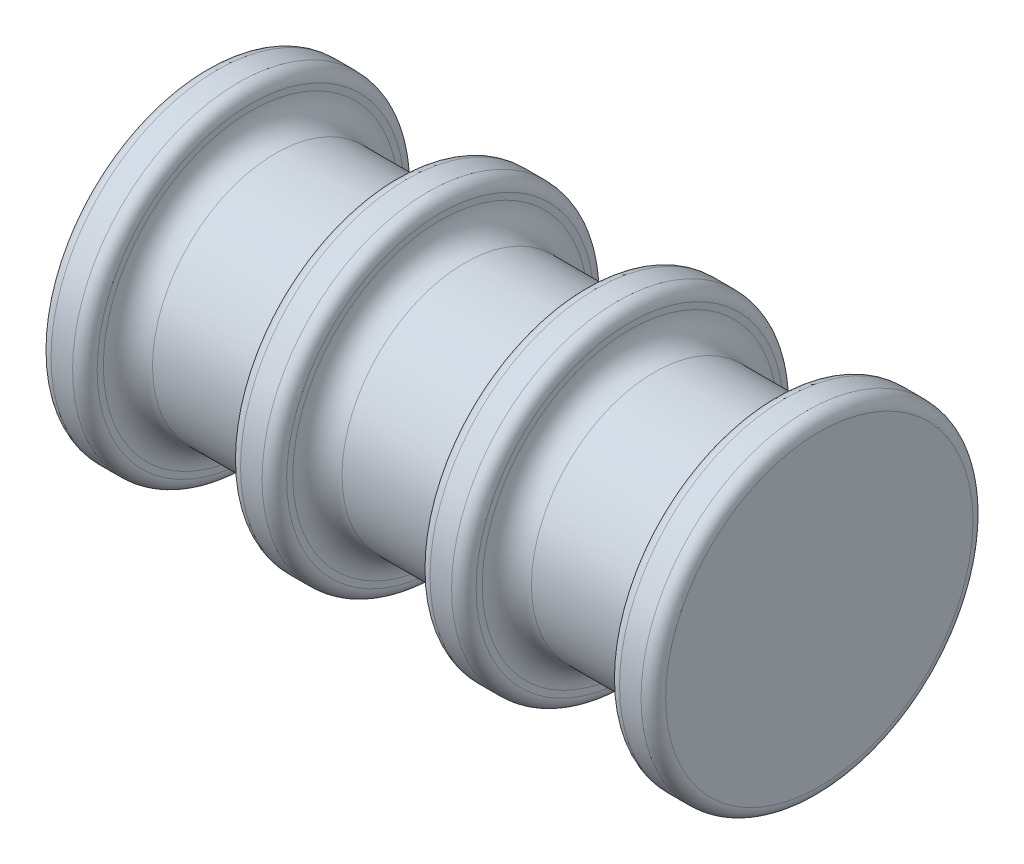
ISO-10303-21;
HEADER;
FILE_DESCRIPTION(('STEP AP214'),'2;1');
FILE_NAME('part.step','',(''),(''),'','','');
FILE_SCHEMA(('AUTOMOTIVE_DESIGN { 1 0 10303 214 1 1 1 1 }'));
ENDSEC;
DATA;
#1=APPLICATION_CONTEXT('core data for automotive mechanical design processes');
#2=APPLICATION_PROTOCOL_DEFINITION('international standard','automotive_design',2000,#1);
#3=PRODUCT_CONTEXT('',#1,'mechanical');
#4=PRODUCT('Part','Part','',(#3));
#5=PRODUCT_RELATED_PRODUCT_CATEGORY('part','',(#4));
#6=PRODUCT_DEFINITION_FORMATION('','',#4);
#7=PRODUCT_DEFINITION_CONTEXT('part definition',#1,'design');
#8=PRODUCT_DEFINITION('design','',#6,#7);
#9=PRODUCT_DEFINITION_SHAPE('','',#8);
#10=(LENGTH_UNIT() NAMED_UNIT(*) SI_UNIT(.MILLI.,.METRE.));
#11=(NAMED_UNIT(*) PLANE_ANGLE_UNIT() SI_UNIT($,.RADIAN.));
#12=(NAMED_UNIT(*) SI_UNIT($,.STERADIAN.) SOLID_ANGLE_UNIT());
#13=UNCERTAINTY_MEASURE_WITH_UNIT(LENGTH_MEASURE(1.E-05),#10,'distance_accuracy_value','');
#14=(GEOMETRIC_REPRESENTATION_CONTEXT(3) GLOBAL_UNCERTAINTY_ASSIGNED_CONTEXT((#13)) GLOBAL_UNIT_ASSIGNED_CONTEXT((#10,
#11,#12)) REPRESENTATION_CONTEXT('',''));
#15=CARTESIAN_POINT('',(0.,0.,0.));
#16=DIRECTION('',(0.,0.,1.));
#17=DIRECTION('',(1.,0.,0.));
#18=AXIS2_PLACEMENT_3D('',#15,#16,#17);
#19=CARTESIAN_POINT('',(0.,0.,0.));
#20=DIRECTION('',(1.,0.,0.));
#21=DIRECTION('',(0.,0.,-1.));
#22=AXIS2_PLACEMENT_3D('',#19,#20,#21);
#23=PLANE('',#22);
#24=CARTESIAN_POINT('',(0.,0.,0.));
#25=DIRECTION('',(1.,0.,0.));
#26=DIRECTION('',(0.,0.,-1.));
#27=AXIS2_PLACEMENT_3D('',#24,#25,#26);
#28=CIRCLE('',#27,5.1054);
#29=CARTESIAN_POINT('',(0.,0.,-5.1054));
#30=VERTEX_POINT('',#29);
#31=EDGE_CURVE('E63',#30,#30,#28,.T.);
#32=ORIENTED_EDGE('',*,*,#31,.T.);
#33=EDGE_LOOP('',(#32));
#34=FACE_BOUND('',#33,.T.);
#35=CARTESIAN_POINT('',(0.,0.,0.));
#36=DIRECTION('',(-1.,0.,0.));
#37=DIRECTION('',(0.,0.,1.));
#38=AXIS2_PLACEMENT_3D('',#35,#36,#37);
#39=CIRCLE('',#38,9.525);
#40=CARTESIAN_POINT('',(0.,0.,9.525));
#41=VERTEX_POINT('',#40);
#42=EDGE_CURVE('E153',#41,#41,#39,.T.);
#43=ORIENTED_EDGE('',*,*,#42,.T.);
#44=EDGE_LOOP('',(#43));
#45=FACE_BOUND('',#44,.T.);
#46=ADVANCED_FACE('F30',(#34,#45),#23,.F.);
#47=CARTESIAN_POINT('',(38.1,0.,-9.525));
#48=DIRECTION('',(-1.,0.,0.));
#49=DIRECTION('',(0.,0.,1.));
#50=AXIS2_PLACEMENT_3D('',#47,#48,#49);
#51=PLANE('',#50);
#52=CARTESIAN_POINT('',(38.1,0.,0.));
#53=DIRECTION('',(-1.,0.,0.));
#54=DIRECTION('',(0.,0.,1.));
#55=AXIS2_PLACEMENT_3D('',#52,#53,#54);
#56=CIRCLE('',#55,9.525);
#57=CARTESIAN_POINT('',(38.1,0.,9.525));
#58=VERTEX_POINT('',#57);
#59=EDGE_CURVE('E72',#58,#58,#56,.T.);
#60=ORIENTED_EDGE('',*,*,#59,.F.);
#61=EDGE_LOOP('',(#60));
#62=FACE_BOUND('',#61,.T.);
#63=ADVANCED_FACE('F178',(#62),#51,.F.);
#64=CARTESIAN_POINT('',(37.338,0.,0.));
#65=DIRECTION('',(-1.,0.,0.));
#66=DIRECTION('',(0.,0.,1.));
#67=AXIS2_PLACEMENT_3D('',#64,#65,#66);
#68=TOROIDAL_SURFACE('',#67,9.525,0.762000000000001);
#69=CARTESIAN_POINT('',(37.338,0.,0.));
#70=DIRECTION('',(-1.,0.,0.));
#71=DIRECTION('',(0.,0.,1.));
#72=AXIS2_PLACEMENT_3D('',#69,#70,#71);
#73=CIRCLE('',#72,10.287);
#74=CARTESIAN_POINT('',(37.338,0.,10.287));
#75=VERTEX_POINT('',#74);
#76=EDGE_CURVE('E75',#75,#75,#73,.T.);
#77=ORIENTED_EDGE('',*,*,#76,.F.);
#78=EDGE_LOOP('',(#77));
#79=FACE_BOUND('',#78,.T.);
#80=ORIENTED_EDGE('',*,*,#59,.T.);
#81=EDGE_LOOP('',(#80));
#82=FACE_BOUND('',#81,.T.);
#83=ADVANCED_FACE('F185',(#79,#82),#68,.T.);
#84=CARTESIAN_POINT('',(0.,0.,0.));
#85=DIRECTION('',(-1.,0.,0.));
#86=DIRECTION('',(0.,0.,1.));
#87=AXIS2_PLACEMENT_3D('',#84,#85,#86);
#88=CYLINDRICAL_SURFACE('',#87,10.287);
#89=CARTESIAN_POINT('',(36.0045,0.,0.));
#90=DIRECTION('',(-1.,0.,0.));
#91=DIRECTION('',(0.,0.,1.));
#92=AXIS2_PLACEMENT_3D('',#89,#90,#91);
#93=CIRCLE('',#92,10.287);
#94=CARTESIAN_POINT('',(36.0045,0.,10.287));
#95=VERTEX_POINT('',#94);
#96=EDGE_CURVE('E78',#95,#95,#93,.T.);
#97=ORIENTED_EDGE('',*,*,#96,.F.);
#98=EDGE_LOOP('',(#97));
#99=FACE_BOUND('',#98,.T.);
#100=ORIENTED_EDGE('',*,*,#76,.T.);
#101=EDGE_LOOP('',(#100));
#102=FACE_BOUND('',#101,.T.);
#103=ADVANCED_FACE('F341',(#99,#102),#88,.T.);
#104=CARTESIAN_POINT('',(36.0045,0.,0.));
#105=DIRECTION('',(-1.,0.,0.));
#106=DIRECTION('',(0.,0.,1.));
#107=AXIS2_PLACEMENT_3D('',#104,#105,#106);
#108=TOROIDAL_SURFACE('',#107,9.525,0.762000000000007);
#109=CARTESIAN_POINT('',(35.2425,0.,0.));
#110=DIRECTION('',(-1.,0.,0.));
#111=DIRECTION('',(0.,0.,1.));
#112=AXIS2_PLACEMENT_3D('',#109,#110,#111);
#113=CIRCLE('',#112,9.525);
#114=CARTESIAN_POINT('',(35.2425,0.,9.525));
#115=VERTEX_POINT('',#114);
#116=EDGE_CURVE('E81',#115,#115,#113,.T.);
#117=ORIENTED_EDGE('',*,*,#116,.F.);
#118=EDGE_LOOP('',(#117));
#119=FACE_BOUND('',#118,.T.);
#120=ORIENTED_EDGE('',*,*,#96,.T.);
#121=EDGE_LOOP('',(#120));
#122=FACE_BOUND('',#121,.T.);
#123=ADVANCED_FACE('F337',(#119,#122),#108,.T.);
#124=CARTESIAN_POINT('',(35.2425,0.,-9.144));
#125=DIRECTION('',(1.,0.,0.));
#126=DIRECTION('',(0.,0.,-1.));
#127=AXIS2_PLACEMENT_3D('',#124,#125,#126);
#128=PLANE('',#127);
#129=CARTESIAN_POINT('',(35.2425,0.,0.));
#130=DIRECTION('',(-1.,0.,0.));
#131=DIRECTION('',(0.,0.,1.));
#132=AXIS2_PLACEMENT_3D('',#129,#130,#131);
#133=CIRCLE('',#132,9.144);
#134=CARTESIAN_POINT('',(35.2425,0.,9.144));
#135=VERTEX_POINT('',#134);
#136=EDGE_CURVE('E84',#135,#135,#133,.T.);
#137=ORIENTED_EDGE('',*,*,#136,.F.);
#138=EDGE_LOOP('',(#137));
#139=FACE_BOUND('',#138,.T.);
#140=ORIENTED_EDGE('',*,*,#116,.T.);
#141=EDGE_LOOP('',(#140));
#142=FACE_BOUND('',#141,.T.);
#143=ADVANCED_FACE('F333',(#139,#142),#128,.F.);
#144=CARTESIAN_POINT('',(33.7185,0.,0.));
#145=DIRECTION('',(-1.,0.,0.));
#146=DIRECTION('',(0.,0.,1.));
#147=AXIS2_PLACEMENT_3D('',#144,#145,#146);
#148=TOROIDAL_SURFACE('',#147,9.144,1.524);
#149=CARTESIAN_POINT('',(33.7185,0.,0.));
#150=DIRECTION('',(-1.,0.,0.));
#151=DIRECTION('',(0.,0.,1.));
#152=AXIS2_PLACEMENT_3D('',#149,#150,#151);
#153=CIRCLE('',#152,7.62);
#154=CARTESIAN_POINT('',(33.7185,0.,7.62));
#155=VERTEX_POINT('',#154);
#156=EDGE_CURVE('E87',#155,#155,#153,.T.);
#157=ORIENTED_EDGE('',*,*,#156,.F.);
#158=EDGE_LOOP('',(#157));
#159=FACE_BOUND('',#158,.T.);
#160=ORIENTED_EDGE('',*,*,#136,.T.);
#161=EDGE_LOOP('',(#160));
#162=FACE_BOUND('',#161,.T.);
#163=ADVANCED_FACE('F329',(#159,#162),#148,.F.);
#164=CARTESIAN_POINT('',(0.,0.,0.));
#165=DIRECTION('',(-1.,0.,0.));
#166=DIRECTION('',(0.,0.,1.));
#167=AXIS2_PLACEMENT_3D('',#164,#165,#166);
#168=CYLINDRICAL_SURFACE('',#167,7.62);
#169=CARTESIAN_POINT('',(27.8765,0.,0.));
#170=DIRECTION('',(-1.,0.,0.));
#171=DIRECTION('',(0.,0.,1.));
#172=AXIS2_PLACEMENT_3D('',#169,#170,#171);
#173=CIRCLE('',#172,7.61999999999999);
#174=CARTESIAN_POINT('',(27.8765,0.,7.61999999999999));
#175=VERTEX_POINT('',#174);
#176=EDGE_CURVE('E90',#175,#175,#173,.T.);
#177=ORIENTED_EDGE('',*,*,#176,.F.);
#178=EDGE_LOOP('',(#177));
#179=FACE_BOUND('',#178,.T.);
#180=ORIENTED_EDGE('',*,*,#156,.T.);
#181=EDGE_LOOP('',(#180));
#182=FACE_BOUND('',#181,.T.);
#183=ADVANCED_FACE('F325',(#179,#182),#168,.T.);
#184=CARTESIAN_POINT('',(27.8765,0.,0.));
#185=DIRECTION('',(-1.,0.,0.));
#186=DIRECTION('',(0.,0.,1.));
#187=AXIS2_PLACEMENT_3D('',#184,#185,#186);
#188=TOROIDAL_SURFACE('',#187,9.14399999999999,1.524);
#189=CARTESIAN_POINT('',(26.3525,0.,0.));
#190=DIRECTION('',(-1.,0.,0.));
#191=DIRECTION('',(0.,0.,1.));
#192=AXIS2_PLACEMENT_3D('',#189,#190,#191);
#193=CIRCLE('',#192,9.14399999999999);
#194=CARTESIAN_POINT('',(26.3525,0.,9.14399999999999));
#195=VERTEX_POINT('',#194);
#196=EDGE_CURVE('E93',#195,#195,#193,.T.);
#197=ORIENTED_EDGE('',*,*,#196,.F.);
#198=EDGE_LOOP('',(#197));
#199=FACE_BOUND('',#198,.T.);
#200=ORIENTED_EDGE('',*,*,#176,.T.);
#201=EDGE_LOOP('',(#200));
#202=FACE_BOUND('',#201,.T.);
#203=ADVANCED_FACE('F321',(#199,#202),#188,.F.);
#204=CARTESIAN_POINT('',(26.3525,0.,-9.525));
#205=DIRECTION('',(-1.,0.,0.));
#206=DIRECTION('',(0.,0.,1.));
#207=AXIS2_PLACEMENT_3D('',#204,#205,#206);
#208=PLANE('',#207);
#209=CARTESIAN_POINT('',(26.3525,0.,0.));
#210=DIRECTION('',(-1.,0.,0.));
#211=DIRECTION('',(0.,0.,1.));
#212=AXIS2_PLACEMENT_3D('',#209,#210,#211);
#213=CIRCLE('',#212,9.525);
#214=CARTESIAN_POINT('',(26.3525,0.,9.525));
#215=VERTEX_POINT('',#214);
#216=EDGE_CURVE('E96',#215,#215,#213,.T.);
#217=ORIENTED_EDGE('',*,*,#216,.F.);
#218=EDGE_LOOP('',(#217));
#219=FACE_BOUND('',#218,.T.);
#220=ORIENTED_EDGE('',*,*,#196,.T.);
#221=EDGE_LOOP('',(#220));
#222=FACE_BOUND('',#221,.T.);
#223=ADVANCED_FACE('F317',(#219,#222),#208,.F.);
#224=CARTESIAN_POINT('',(25.5905,0.,0.));
#225=DIRECTION('',(-1.,0.,0.));
#226=DIRECTION('',(0.,0.,1.));
#227=AXIS2_PLACEMENT_3D('',#224,#225,#226);
#228=TOROIDAL_SURFACE('',#227,9.525,0.762000000000001);
#229=CARTESIAN_POINT('',(25.5905,0.,0.));
#230=DIRECTION('',(-1.,0.,0.));
#231=DIRECTION('',(0.,0.,1.));
#232=AXIS2_PLACEMENT_3D('',#229,#230,#231);
#233=CIRCLE('',#232,10.287);
#234=CARTESIAN_POINT('',(25.5905,0.,10.287));
#235=VERTEX_POINT('',#234);
#236=EDGE_CURVE('E99',#235,#235,#233,.T.);
#237=ORIENTED_EDGE('',*,*,#236,.F.);
#238=EDGE_LOOP('',(#237));
#239=FACE_BOUND('',#238,.T.);
#240=ORIENTED_EDGE('',*,*,#216,.T.);
#241=EDGE_LOOP('',(#240));
#242=FACE_BOUND('',#241,.T.);
#243=ADVANCED_FACE('F313',(#239,#242),#228,.T.);
#244=CARTESIAN_POINT('',(0.,0.,0.));
#245=DIRECTION('',(-1.,0.,0.));
#246=DIRECTION('',(0.,0.,1.));
#247=AXIS2_PLACEMENT_3D('',#244,#245,#246);
#248=CYLINDRICAL_SURFACE('',#247,10.287);
#249=CARTESIAN_POINT('',(24.257,0.,0.));
#250=DIRECTION('',(-1.,0.,0.));
#251=DIRECTION('',(0.,0.,1.));
#252=AXIS2_PLACEMENT_3D('',#249,#250,#251);
#253=CIRCLE('',#252,10.287);
#254=CARTESIAN_POINT('',(24.257,0.,10.287));
#255=VERTEX_POINT('',#254);
#256=EDGE_CURVE('E102',#255,#255,#253,.T.);
#257=ORIENTED_EDGE('',*,*,#256,.F.);
#258=EDGE_LOOP('',(#257));
#259=FACE_BOUND('',#258,.T.);
#260=ORIENTED_EDGE('',*,*,#236,.T.);
#261=EDGE_LOOP('',(#260));
#262=FACE_BOUND('',#261,.T.);
#263=ADVANCED_FACE('F309',(#259,#262),#248,.T.);
#264=CARTESIAN_POINT('',(24.257,0.,0.));
#265=DIRECTION('',(-1.,0.,0.));
#266=DIRECTION('',(0.,0.,1.));
#267=AXIS2_PLACEMENT_3D('',#264,#265,#266);
#268=TOROIDAL_SURFACE('',#267,9.525,0.762000000000001);
#269=CARTESIAN_POINT('',(23.495,0.,0.));
#270=DIRECTION('',(-1.,0.,0.));
#271=DIRECTION('',(0.,0.,1.));
#272=AXIS2_PLACEMENT_3D('',#269,#270,#271);
#273=CIRCLE('',#272,9.525);
#274=CARTESIAN_POINT('',(23.495,0.,9.525));
#275=VERTEX_POINT('',#274);
#276=EDGE_CURVE('E105',#275,#275,#273,.T.);
#277=ORIENTED_EDGE('',*,*,#276,.F.);
#278=EDGE_LOOP('',(#277));
#279=FACE_BOUND('',#278,.T.);
#280=ORIENTED_EDGE('',*,*,#256,.T.);
#281=EDGE_LOOP('',(#280));
#282=FACE_BOUND('',#281,.T.);
#283=ADVANCED_FACE('F305',(#279,#282),#268,.T.);
#284=CARTESIAN_POINT('',(23.495,0.,-9.144));
#285=DIRECTION('',(1.,0.,0.));
#286=DIRECTION('',(0.,0.,-1.));
#287=AXIS2_PLACEMENT_3D('',#284,#285,#286);
#288=PLANE('',#287);
#289=CARTESIAN_POINT('',(23.495,0.,0.));
#290=DIRECTION('',(-1.,0.,0.));
#291=DIRECTION('',(0.,0.,1.));
#292=AXIS2_PLACEMENT_3D('',#289,#290,#291);
#293=CIRCLE('',#292,9.144);
#294=CARTESIAN_POINT('',(23.495,0.,9.144));
#295=VERTEX_POINT('',#294);
#296=EDGE_CURVE('E108',#295,#295,#293,.T.);
#297=ORIENTED_EDGE('',*,*,#296,.F.);
#298=EDGE_LOOP('',(#297));
#299=FACE_BOUND('',#298,.T.);
#300=ORIENTED_EDGE('',*,*,#276,.T.);
#301=EDGE_LOOP('',(#300));
#302=FACE_BOUND('',#301,.T.);
#303=ADVANCED_FACE('F301',(#299,#302),#288,.F.);
#304=CARTESIAN_POINT('',(21.971,0.,0.));
#305=DIRECTION('',(-1.,0.,0.));
#306=DIRECTION('',(0.,0.,1.));
#307=AXIS2_PLACEMENT_3D('',#304,#305,#306);
#308=TOROIDAL_SURFACE('',#307,9.144,1.524);
#309=CARTESIAN_POINT('',(21.971,0.,0.));
#310=DIRECTION('',(-1.,0.,0.));
#311=DIRECTION('',(0.,0.,1.));
#312=AXIS2_PLACEMENT_3D('',#309,#310,#311);
#313=CIRCLE('',#312,7.62);
#314=CARTESIAN_POINT('',(21.971,0.,7.62));
#315=VERTEX_POINT('',#314);
#316=EDGE_CURVE('E111',#315,#315,#313,.T.);
#317=ORIENTED_EDGE('',*,*,#316,.F.);
#318=EDGE_LOOP('',(#317));
#319=FACE_BOUND('',#318,.T.);
#320=ORIENTED_EDGE('',*,*,#296,.T.);
#321=EDGE_LOOP('',(#320));
#322=FACE_BOUND('',#321,.T.);
#323=ADVANCED_FACE('F297',(#319,#322),#308,.F.);
#324=CARTESIAN_POINT('',(0.,0.,0.));
#325=DIRECTION('',(-1.,0.,0.));
#326=DIRECTION('',(0.,0.,1.));
#327=AXIS2_PLACEMENT_3D('',#324,#325,#326);
#328=CYLINDRICAL_SURFACE('',#327,7.62);
#329=CARTESIAN_POINT('',(16.129,0.,0.));
#330=DIRECTION('',(-1.,0.,0.));
#331=DIRECTION('',(0.,0.,1.));
#332=AXIS2_PLACEMENT_3D('',#329,#330,#331);
#333=CIRCLE('',#332,7.62);
#334=CARTESIAN_POINT('',(16.129,0.,7.62));
#335=VERTEX_POINT('',#334);
#336=EDGE_CURVE('E114',#335,#335,#333,.T.);
#337=ORIENTED_EDGE('',*,*,#336,.F.);
#338=EDGE_LOOP('',(#337));
#339=FACE_BOUND('',#338,.T.);
#340=ORIENTED_EDGE('',*,*,#316,.T.);
#341=EDGE_LOOP('',(#340));
#342=FACE_BOUND('',#341,.T.);
#343=ADVANCED_FACE('F293',(#339,#342),#328,.T.);
#344=CARTESIAN_POINT('',(16.129,0.,0.));
#345=DIRECTION('',(-1.,0.,0.));
#346=DIRECTION('',(0.,0.,1.));
#347=AXIS2_PLACEMENT_3D('',#344,#345,#346);
#348=TOROIDAL_SURFACE('',#347,9.144,1.524);
#349=CARTESIAN_POINT('',(14.605,0.,0.));
#350=DIRECTION('',(-1.,0.,0.));
#351=DIRECTION('',(0.,0.,1.));
#352=AXIS2_PLACEMENT_3D('',#349,#350,#351);
#353=CIRCLE('',#352,9.144);
#354=CARTESIAN_POINT('',(14.605,0.,9.144));
#355=VERTEX_POINT('',#354);
#356=EDGE_CURVE('E117',#355,#355,#353,.T.);
#357=ORIENTED_EDGE('',*,*,#356,.F.);
#358=EDGE_LOOP('',(#357));
#359=FACE_BOUND('',#358,.T.);
#360=ORIENTED_EDGE('',*,*,#336,.T.);
#361=EDGE_LOOP('',(#360));
#362=FACE_BOUND('',#361,.T.);
#363=ADVANCED_FACE('F289',(#359,#362),#348,.F.);
#364=CARTESIAN_POINT('',(14.605,0.,-9.525));
#365=DIRECTION('',(-1.,0.,0.));
#366=DIRECTION('',(0.,0.,1.));
#367=AXIS2_PLACEMENT_3D('',#364,#365,#366);
#368=PLANE('',#367);
#369=CARTESIAN_POINT('',(14.605,0.,0.));
#370=DIRECTION('',(-1.,0.,0.));
#371=DIRECTION('',(0.,0.,1.));
#372=AXIS2_PLACEMENT_3D('',#369,#370,#371);
#373=CIRCLE('',#372,9.525);
#374=CARTESIAN_POINT('',(14.605,0.,9.525));
#375=VERTEX_POINT('',#374);
#376=EDGE_CURVE('E120',#375,#375,#373,.T.);
#377=ORIENTED_EDGE('',*,*,#376,.F.);
#378=EDGE_LOOP('',(#377));
#379=FACE_BOUND('',#378,.T.);
#380=ORIENTED_EDGE('',*,*,#356,.T.);
#381=EDGE_LOOP('',(#380));
#382=FACE_BOUND('',#381,.T.);
#383=ADVANCED_FACE('F285',(#379,#382),#368,.F.);
#384=CARTESIAN_POINT('',(13.843,0.,0.));
#385=DIRECTION('',(-1.,0.,0.));
#386=DIRECTION('',(0.,0.,1.));
#387=AXIS2_PLACEMENT_3D('',#384,#385,#386);
#388=TOROIDAL_SURFACE('',#387,9.525,0.762000000000001);
#389=CARTESIAN_POINT('',(13.843,0.,0.));
#390=DIRECTION('',(-1.,0.,0.));
#391=DIRECTION('',(0.,0.,1.));
#392=AXIS2_PLACEMENT_3D('',#389,#390,#391);
#393=CIRCLE('',#392,10.287);
#394=CARTESIAN_POINT('',(13.843,0.,10.287));
#395=VERTEX_POINT('',#394);
#396=EDGE_CURVE('E123',#395,#395,#393,.T.);
#397=ORIENTED_EDGE('',*,*,#396,.F.);
#398=EDGE_LOOP('',(#397));
#399=FACE_BOUND('',#398,.T.);
#400=ORIENTED_EDGE('',*,*,#376,.T.);
#401=EDGE_LOOP('',(#400));
#402=FACE_BOUND('',#401,.T.);
#403=ADVANCED_FACE('F281',(#399,#402),#388,.T.);
#404=CARTESIAN_POINT('',(0.,0.,0.));
#405=DIRECTION('',(-1.,0.,0.));
#406=DIRECTION('',(0.,0.,1.));
#407=AXIS2_PLACEMENT_3D('',#404,#405,#406);
#408=CYLINDRICAL_SURFACE('',#407,10.287);
#409=CARTESIAN_POINT('',(12.5095,0.,0.));
#410=DIRECTION('',(-1.,0.,0.));
#411=DIRECTION('',(0.,0.,1.));
#412=AXIS2_PLACEMENT_3D('',#409,#410,#411);
#413=CIRCLE('',#412,10.287);
#414=CARTESIAN_POINT('',(12.5095,0.,10.287));
#415=VERTEX_POINT('',#414);
#416=EDGE_CURVE('E126',#415,#415,#413,.T.);
#417=ORIENTED_EDGE('',*,*,#416,.F.);
#418=EDGE_LOOP('',(#417));
#419=FACE_BOUND('',#418,.T.);
#420=ORIENTED_EDGE('',*,*,#396,.T.);
#421=EDGE_LOOP('',(#420));
#422=FACE_BOUND('',#421,.T.);
#423=ADVANCED_FACE('F277',(#419,#422),#408,.T.);
#424=CARTESIAN_POINT('',(12.5095,0.,0.));
#425=DIRECTION('',(-1.,0.,0.));
#426=DIRECTION('',(0.,0.,1.));
#427=AXIS2_PLACEMENT_3D('',#424,#425,#426);
#428=TOROIDAL_SURFACE('',#427,9.525,0.762000000000001);
#429=CARTESIAN_POINT('',(11.7475,0.,0.));
#430=DIRECTION('',(-1.,0.,0.));
#431=DIRECTION('',(0.,0.,1.));
#432=AXIS2_PLACEMENT_3D('',#429,#430,#431);
#433=CIRCLE('',#432,9.525);
#434=CARTESIAN_POINT('',(11.7475,0.,9.525));
#435=VERTEX_POINT('',#434);
#436=EDGE_CURVE('E129',#435,#435,#433,.T.);
#437=ORIENTED_EDGE('',*,*,#436,.F.);
#438=EDGE_LOOP('',(#437));
#439=FACE_BOUND('',#438,.T.);
#440=ORIENTED_EDGE('',*,*,#416,.T.);
#441=EDGE_LOOP('',(#440));
#442=FACE_BOUND('',#441,.T.);
#443=ADVANCED_FACE('F273',(#439,#442),#428,.T.);
#444=CARTESIAN_POINT('',(11.7475,0.,-9.144));
#445=DIRECTION('',(1.,0.,0.));
#446=DIRECTION('',(0.,0.,-1.));
#447=AXIS2_PLACEMENT_3D('',#444,#445,#446);
#448=PLANE('',#447);
#449=CARTESIAN_POINT('',(11.7475,0.,0.));
#450=DIRECTION('',(-1.,0.,0.));
#451=DIRECTION('',(0.,0.,1.));
#452=AXIS2_PLACEMENT_3D('',#449,#450,#451);
#453=CIRCLE('',#452,9.144);
#454=CARTESIAN_POINT('',(11.7475,0.,9.144));
#455=VERTEX_POINT('',#454);
#456=EDGE_CURVE('E132',#455,#455,#453,.T.);
#457=ORIENTED_EDGE('',*,*,#456,.F.);
#458=EDGE_LOOP('',(#457));
#459=FACE_BOUND('',#458,.T.);
#460=ORIENTED_EDGE('',*,*,#436,.T.);
#461=EDGE_LOOP('',(#460));
#462=FACE_BOUND('',#461,.T.);
#463=ADVANCED_FACE('F269',(#459,#462),#448,.F.);
#464=CARTESIAN_POINT('',(10.2235,0.,0.));
#465=DIRECTION('',(-1.,0.,0.));
#466=DIRECTION('',(0.,0.,1.));
#467=AXIS2_PLACEMENT_3D('',#464,#465,#466);
#468=TOROIDAL_SURFACE('',#467,9.144,1.524);
#469=CARTESIAN_POINT('',(10.2235,0.,0.));
#470=DIRECTION('',(-1.,0.,0.));
#471=DIRECTION('',(0.,0.,1.));
#472=AXIS2_PLACEMENT_3D('',#469,#470,#471);
#473=CIRCLE('',#472,7.62);
#474=CARTESIAN_POINT('',(10.2235,0.,7.62));
#475=VERTEX_POINT('',#474);
#476=EDGE_CURVE('E135',#475,#475,#473,.T.);
#477=ORIENTED_EDGE('',*,*,#476,.F.);
#478=EDGE_LOOP('',(#477));
#479=FACE_BOUND('',#478,.T.);
#480=ORIENTED_EDGE('',*,*,#456,.T.);
#481=EDGE_LOOP('',(#480));
#482=FACE_BOUND('',#481,.T.);
#483=ADVANCED_FACE('F265',(#479,#482),#468,.F.);
#484=CARTESIAN_POINT('',(0.,0.,0.));
#485=DIRECTION('',(-1.,0.,0.));
#486=DIRECTION('',(0.,0.,1.));
#487=AXIS2_PLACEMENT_3D('',#484,#485,#486);
#488=CYLINDRICAL_SURFACE('',#487,7.62);
#489=CARTESIAN_POINT('',(4.3815,0.,0.));
#490=DIRECTION('',(-1.,0.,0.));
#491=DIRECTION('',(0.,0.,1.));
#492=AXIS2_PLACEMENT_3D('',#489,#490,#491);
#493=CIRCLE('',#492,7.62);
#494=CARTESIAN_POINT('',(4.3815,0.,7.62));
#495=VERTEX_POINT('',#494);
#496=EDGE_CURVE('E138',#495,#495,#493,.T.);
#497=ORIENTED_EDGE('',*,*,#496,.F.);
#498=EDGE_LOOP('',(#497));
#499=FACE_BOUND('',#498,.T.);
#500=ORIENTED_EDGE('',*,*,#476,.T.);
#501=EDGE_LOOP('',(#500));
#502=FACE_BOUND('',#501,.T.);
#503=ADVANCED_FACE('F261',(#499,#502),#488,.T.);
#504=CARTESIAN_POINT('',(4.3815,0.,0.));
#505=DIRECTION('',(-1.,0.,0.));
#506=DIRECTION('',(0.,0.,1.));
#507=AXIS2_PLACEMENT_3D('',#504,#505,#506);
#508=TOROIDAL_SURFACE('',#507,9.144,1.524);
#509=CARTESIAN_POINT('',(2.8575,0.,0.));
#510=DIRECTION('',(-1.,0.,0.));
#511=DIRECTION('',(0.,0.,1.));
#512=AXIS2_PLACEMENT_3D('',#509,#510,#511);
#513=CIRCLE('',#512,9.144);
#514=CARTESIAN_POINT('',(2.8575,0.,9.144));
#515=VERTEX_POINT('',#514);
#516=EDGE_CURVE('E141',#515,#515,#513,.T.);
#517=ORIENTED_EDGE('',*,*,#516,.F.);
#518=EDGE_LOOP('',(#517));
#519=FACE_BOUND('',#518,.T.);
#520=ORIENTED_EDGE('',*,*,#496,.T.);
#521=EDGE_LOOP('',(#520));
#522=FACE_BOUND('',#521,.T.);
#523=ADVANCED_FACE('F257',(#519,#522),#508,.F.);
#524=CARTESIAN_POINT('',(2.8575,0.,-9.525));
#525=DIRECTION('',(-1.,0.,0.));
#526=DIRECTION('',(0.,0.,1.));
#527=AXIS2_PLACEMENT_3D('',#524,#525,#526);
#528=PLANE('',#527);
#529=CARTESIAN_POINT('',(2.8575,0.,0.));
#530=DIRECTION('',(-1.,0.,0.));
#531=DIRECTION('',(0.,0.,1.));
#532=AXIS2_PLACEMENT_3D('',#529,#530,#531);
#533=CIRCLE('',#532,9.525);
#534=CARTESIAN_POINT('',(2.8575,0.,9.525));
#535=VERTEX_POINT('',#534);
#536=EDGE_CURVE('E144',#535,#535,#533,.T.);
#537=ORIENTED_EDGE('',*,*,#536,.F.);
#538=EDGE_LOOP('',(#537));
#539=FACE_BOUND('',#538,.T.);
#540=ORIENTED_EDGE('',*,*,#516,.T.);
#541=EDGE_LOOP('',(#540));
#542=FACE_BOUND('',#541,.T.);
#543=ADVANCED_FACE('F253',(#539,#542),#528,.F.);
#544=CARTESIAN_POINT('',(2.0955,0.,0.));
#545=DIRECTION('',(-1.,0.,0.));
#546=DIRECTION('',(0.,0.,1.));
#547=AXIS2_PLACEMENT_3D('',#544,#545,#546);
#548=TOROIDAL_SURFACE('',#547,9.525,0.761999999999999);
#549=CARTESIAN_POINT('',(2.0955,0.,0.));
#550=DIRECTION('',(-1.,0.,0.));
#551=DIRECTION('',(0.,0.,1.));
#552=AXIS2_PLACEMENT_3D('',#549,#550,#551);
#553=CIRCLE('',#552,10.287);
#554=CARTESIAN_POINT('',(2.0955,0.,10.287));
#555=VERTEX_POINT('',#554);
#556=EDGE_CURVE('E147',#555,#555,#553,.T.);
#557=ORIENTED_EDGE('',*,*,#556,.F.);
#558=EDGE_LOOP('',(#557));
#559=FACE_BOUND('',#558,.T.);
#560=ORIENTED_EDGE('',*,*,#536,.T.);
#561=EDGE_LOOP('',(#560));
#562=FACE_BOUND('',#561,.T.);
#563=ADVANCED_FACE('F249',(#559,#562),#548,.T.);
#564=CARTESIAN_POINT('',(0.,0.,0.));
#565=DIRECTION('',(-1.,0.,0.));
#566=DIRECTION('',(0.,0.,1.));
#567=AXIS2_PLACEMENT_3D('',#564,#565,#566);
#568=CYLINDRICAL_SURFACE('',#567,10.287);
#569=CARTESIAN_POINT('',(0.762,0.,0.));
#570=DIRECTION('',(-1.,0.,0.));
#571=DIRECTION('',(0.,0.,1.));
#572=AXIS2_PLACEMENT_3D('',#569,#570,#571);
#573=CIRCLE('',#572,10.287);
#574=CARTESIAN_POINT('',(0.762,0.,10.287));
#575=VERTEX_POINT('',#574);
#576=EDGE_CURVE('E150',#575,#575,#573,.T.);
#577=ORIENTED_EDGE('',*,*,#576,.F.);
#578=EDGE_LOOP('',(#577));
#579=FACE_BOUND('',#578,.T.);
#580=ORIENTED_EDGE('',*,*,#556,.T.);
#581=EDGE_LOOP('',(#580));
#582=FACE_BOUND('',#581,.T.);
#583=ADVANCED_FACE('F245',(#579,#582),#568,.T.);
#584=CARTESIAN_POINT('',(0.762,0.,0.));
#585=DIRECTION('',(-1.,0.,0.));
#586=DIRECTION('',(0.,0.,1.));
#587=AXIS2_PLACEMENT_3D('',#584,#585,#586);
#588=TOROIDAL_SURFACE('',#587,9.525,0.761999999999999);
#589=ORIENTED_EDGE('',*,*,#42,.F.);
#590=EDGE_LOOP('',(#589));
#591=FACE_BOUND('',#590,.T.);
#592=ORIENTED_EDGE('',*,*,#576,.T.);
#593=EDGE_LOOP('',(#592));
#594=FACE_BOUND('',#593,.T.);
#595=ADVANCED_FACE('F239',(#591,#594),#588,.T.);
#596=CARTESIAN_POINT('',(0.254,0.,0.));
#597=DIRECTION('',(-1.,0.,0.));
#598=DIRECTION('',(0.,0.,1.));
#599=AXIS2_PLACEMENT_3D('',#596,#597,#598);
#600=CYLINDRICAL_SURFACE('',#599,5.08);
#601=CARTESIAN_POINT('',(0.0254000000000003,0.,0.));
#602=DIRECTION('',(1.,0.,0.));
#603=DIRECTION('',(0.,0.,-1.));
#604=AXIS2_PLACEMENT_3D('',#601,#602,#603);
#605=CIRCLE('',#604,5.08);
#606=CARTESIAN_POINT('',(0.0254000000000003,0.,-5.08));
#607=VERTEX_POINT('',#606);
#608=EDGE_CURVE('E66',#607,#607,#605,.F.);
#609=ORIENTED_EDGE('',*,*,#608,.T.);
#610=EDGE_LOOP('',(#609));
#611=FACE_BOUND('',#610,.T.);
#612=CARTESIAN_POINT('',(0.2286,0.,0.));
#613=DIRECTION('',(-1.,0.,0.));
#614=DIRECTION('',(0.,0.,1.));
#615=AXIS2_PLACEMENT_3D('',#612,#613,#614);
#616=CIRCLE('',#615,5.08);
#617=CARTESIAN_POINT('',(0.2286,0.,5.08));
#618=VERTEX_POINT('',#617);
#619=EDGE_CURVE('E69',#618,#618,#616,.F.);
#620=ORIENTED_EDGE('',*,*,#619,.T.);
#621=EDGE_LOOP('',(#620));
#622=FACE_BOUND('',#621,.T.);
#623=ADVANCED_FACE('F233',(#611,#622),#600,.F.);
#624=CARTESIAN_POINT('',(0.254,0.,0.));
#625=DIRECTION('',(-1.,0.,0.));
#626=DIRECTION('',(0.,0.,1.));
#627=AXIS2_PLACEMENT_3D('',#624,#625,#626);
#628=PLANE('',#627);
#629=CARTESIAN_POINT('',(0.254,0.,0.));
#630=DIRECTION('',(-1.,0.,0.));
#631=DIRECTION('',(0.,0.,1.));
#632=AXIS2_PLACEMENT_3D('',#629,#630,#631);
#633=CIRCLE('',#632,3.937);
#634=CARTESIAN_POINT('',(0.254,0.,3.937));
#635=VERTEX_POINT('',#634);
#636=EDGE_CURVE('E38',#635,#635,#633,.F.);
#637=ORIENTED_EDGE('',*,*,#636,.T.);
#638=EDGE_LOOP('',(#637));
#639=FACE_BOUND('',#638,.T.);
#640=CARTESIAN_POINT('',(0.254,0.,0.));
#641=DIRECTION('',(-1.,0.,0.));
#642=DIRECTION('',(0.,0.,1.));
#643=AXIS2_PLACEMENT_3D('',#640,#641,#642);
#644=CIRCLE('',#643,5.0546);
#645=CARTESIAN_POINT('',(0.254,0.,5.0546));
#646=VERTEX_POINT('',#645);
#647=EDGE_CURVE('E60',#646,#646,#644,.T.);
#648=ORIENTED_EDGE('',*,*,#647,.T.);
#649=EDGE_LOOP('',(#648));
#650=FACE_BOUND('',#649,.T.);
#651=ADVANCED_FACE('F174',(#639,#650),#628,.T.);
#652=CARTESIAN_POINT('',(0.,0.,0.));
#653=DIRECTION('',(1.,0.,0.));
#654=DIRECTION('',(0.,0.,-1.));
#655=AXIS2_PLACEMENT_3D('',#652,#653,#654);
#656=CIRCLE('',#655,3.683);
#657=CARTESIAN_POINT('',(0.,0.,-3.683));
#658=VERTEX_POINT('',#657);
#659=EDGE_CURVE('E10',#658,#658,#656,.F.);
#660=ORIENTED_EDGE('',*,*,#659,.T.);
#661=EDGE_LOOP('',(#660));
#662=FACE_BOUND('',#661,.T.);
#663=CARTESIAN_POINT('',(0.,0.,0.));
#664=DIRECTION('',(1.,0.,0.));
#665=DIRECTION('',(0.,0.,-1.));
#666=AXIS2_PLACEMENT_3D('',#663,#664,#665);
#667=CIRCLE('',#666,1.89058524938029);
#668=CARTESIAN_POINT('',(0.,0.,-1.89058524938029));
#669=VERTEX_POINT('',#668);
#670=EDGE_CURVE('E42',#669,#669,#667,.T.);
#671=ORIENTED_EDGE('',*,*,#670,.T.);
#672=EDGE_LOOP('',(#671));
#673=FACE_BOUND('',#672,.T.);
#674=ADVANCED_FACE('F163',(#662,#673),#23,.F.);
#675=CARTESIAN_POINT('',(0.2032,0.,0.));
#676=DIRECTION('',(-1.,0.,0.));
#677=DIRECTION('',(0.,0.,1.));
#678=AXIS2_PLACEMENT_3D('',#675,#676,#677);
#679=PLANE('',#678);
#680=CARTESIAN_POINT('',(0.2032,0.,0.));
#681=DIRECTION('',(-1.,0.,0.));
#682=DIRECTION('',(0.,0.,1.));
#683=AXIS2_PLACEMENT_3D('',#680,#681,#682);
#684=CIRCLE('',#683,1.68738524938029);
#685=CARTESIAN_POINT('',(0.2032,0.,1.68738524938029));
#686=VERTEX_POINT('',#685);
#687=EDGE_CURVE('E51',#686,#686,#684,.T.);
#688=ORIENTED_EDGE('',*,*,#687,.T.);
#689=EDGE_LOOP('',(#688));
#690=FACE_BOUND('',#689,.T.);
#691=CARTESIAN_POINT('',(0.2032,0.,0.));
#692=DIRECTION('',(-1.,0.,0.));
#693=DIRECTION('',(0.,0.,1.));
#694=AXIS2_PLACEMENT_3D('',#691,#692,#693);
#695=CIRCLE('',#694,1.26587117892996);
#696=CARTESIAN_POINT('',(0.2032,0.,1.26587117892996));
#697=VERTEX_POINT('',#696);
#698=EDGE_CURVE('E48',#697,#697,#695,.T.);
#699=ORIENTED_EDGE('',*,*,#698,.F.);
#700=EDGE_LOOP('',(#699));
#701=FACE_BOUND('',#700,.T.);
#702=ADVANCED_FACE('F161',(#690,#701),#679,.T.);
#703=CARTESIAN_POINT('',(0.2032,0.,0.));
#704=DIRECTION('',(-1.,0.,0.));
#705=DIRECTION('',(0.,0.,1.));
#706=AXIS2_PLACEMENT_3D('',#703,#704,#705);
#707=CYLINDRICAL_SURFACE('',#706,1.26587117892996);
#708=CARTESIAN_POINT('',(0.1016,0.,0.));
#709=DIRECTION('',(1.,0.,0.));
#710=DIRECTION('',(0.,0.,-1.));
#711=AXIS2_PLACEMENT_3D('',#708,#709,#710);
#712=CIRCLE('',#711,1.26587117892996);
#713=CARTESIAN_POINT('',(0.1016,0.,-1.26587117892996));
#714=VERTEX_POINT('',#713);
#715=EDGE_CURVE('E54',#714,#714,#712,.T.);
#716=ORIENTED_EDGE('',*,*,#715,.T.);
#717=EDGE_LOOP('',(#716));
#718=FACE_BOUND('',#717,.T.);
#719=ORIENTED_EDGE('',*,*,#698,.T.);
#720=EDGE_LOOP('',(#719));
#721=FACE_BOUND('',#720,.T.);
#722=ADVANCED_FACE('F159',(#718,#721),#707,.T.);
#723=CARTESIAN_POINT('',(0.,0.,0.));
#724=DIRECTION('',(1.,0.,0.));
#725=DIRECTION('',(0.,0.,-1.));
#726=AXIS2_PLACEMENT_3D('',#723,#724,#725);
#727=CIRCLE('',#726,1.16427117892996);
#728=CARTESIAN_POINT('',(0.,0.,-1.16427117892996));
#729=VERTEX_POINT('',#728);
#730=EDGE_CURVE('E57',#729,#729,#727,.F.);
#731=ORIENTED_EDGE('',*,*,#730,.T.);
#732=EDGE_LOOP('',(#731));
#733=FACE_BOUND('',#732,.T.);
#734=ADVANCED_FACE('F170',(#733),#23,.F.);
#735=CARTESIAN_POINT('',(0.0254000000000003,0.,0.));
#736=DIRECTION('',(1.,0.,0.));
#737=DIRECTION('',(0.,0.,-1.));
#738=AXIS2_PLACEMENT_3D('',#735,#736,#737);
#739=TOROIDAL_SURFACE('',#738,5.1054,0.0254);
#740=ORIENTED_EDGE('',*,*,#31,.F.);
#741=EDGE_LOOP('',(#740));
#742=FACE_BOUND('',#741,.T.);
#743=ORIENTED_EDGE('',*,*,#608,.F.);
#744=EDGE_LOOP('',(#743));
#745=FACE_BOUND('',#744,.T.);
#746=ADVANCED_FACE('F191',(#742,#745),#739,.T.);
#747=CARTESIAN_POINT('',(0.2286,0.,0.));
#748=DIRECTION('',(-1.,0.,0.));
#749=DIRECTION('',(0.,0.,1.));
#750=AXIS2_PLACEMENT_3D('',#747,#748,#749);
#751=TOROIDAL_SURFACE('',#750,5.0546,0.0254);
#752=ORIENTED_EDGE('',*,*,#619,.F.);
#753=EDGE_LOOP('',(#752));
#754=FACE_BOUND('',#753,.T.);
#755=ORIENTED_EDGE('',*,*,#647,.F.);
#756=EDGE_LOOP('',(#755));
#757=FACE_BOUND('',#756,.T.);
#758=ADVANCED_FACE('F198',(#754,#757),#751,.F.);
#759=CARTESIAN_POINT('',(0.1016,0.,0.));
#760=DIRECTION('',(1.,0.,0.));
#761=DIRECTION('',(0.,0.,-1.));
#762=AXIS2_PLACEMENT_3D('',#759,#760,#761);
#763=TOROIDAL_SURFACE('',#762,1.16427117892996,0.1016);
#764=ORIENTED_EDGE('',*,*,#715,.F.);
#765=EDGE_LOOP('',(#764));
#766=FACE_BOUND('',#765,.T.);
#767=ORIENTED_EDGE('',*,*,#730,.F.);
#768=EDGE_LOOP('',(#767));
#769=FACE_BOUND('',#768,.T.);
#770=ADVANCED_FACE('F202',(#766,#769),#763,.T.);
#771=CARTESIAN_POINT('',(0.1016,0.,0.));
#772=DIRECTION('',(1.,0.,0.));
#773=DIRECTION('',(0.,0.,-1.));
#774=AXIS2_PLACEMENT_3D('',#771,#772,#773);
#775=TOROIDAL_SURFACE('',#774,1.89058524938029,0.1016);
#776=ORIENTED_EDGE('',*,*,#670,.F.);
#777=EDGE_LOOP('',(#776));
#778=FACE_BOUND('',#777,.T.);
#779=CARTESIAN_POINT('',(0.1016,0.,0.));
#780=DIRECTION('',(1.,0.,0.));
#781=DIRECTION('',(0.,0.,-1.));
#782=AXIS2_PLACEMENT_3D('',#779,#780,#781);
#783=CIRCLE('',#782,1.78898524938029);
#784=CARTESIAN_POINT('',(0.1016,0.,-1.78898524938029));
#785=VERTEX_POINT('',#784);
#786=EDGE_CURVE('E45',#785,#785,#783,.F.);
#787=ORIENTED_EDGE('',*,*,#786,.F.);
#788=EDGE_LOOP('',(#787));
#789=FACE_BOUND('',#788,.T.);
#790=ADVANCED_FACE('F204',(#778,#789),#775,.T.);
#791=CARTESIAN_POINT('',(0.1016,0.,0.));
#792=DIRECTION('',(-1.,0.,0.));
#793=DIRECTION('',(0.,0.,1.));
#794=AXIS2_PLACEMENT_3D('',#791,#792,#793);
#795=TOROIDAL_SURFACE('',#794,1.68738524938029,0.1016);
#796=ORIENTED_EDGE('',*,*,#786,.T.);
#797=EDGE_LOOP('',(#796));
#798=FACE_BOUND('',#797,.T.);
#799=ORIENTED_EDGE('',*,*,#687,.F.);
#800=EDGE_LOOP('',(#799));
#801=FACE_BOUND('',#800,.T.);
#802=ADVANCED_FACE('F210',(#798,#801),#795,.F.);
#803=CARTESIAN_POINT('',(0.127,0.,0.));
#804=DIRECTION('',(1.,0.,0.));
#805=DIRECTION('',(0.,0.,-1.));
#806=AXIS2_PLACEMENT_3D('',#803,#804,#805);
#807=TOROIDAL_SURFACE('',#806,3.683,0.127);
#808=ORIENTED_EDGE('',*,*,#659,.F.);
#809=EDGE_LOOP('',(#808));
#810=FACE_BOUND('',#809,.T.);
#811=CARTESIAN_POINT('',(0.127,0.,0.));
#812=DIRECTION('',(1.,0.,0.));
#813=DIRECTION('',(0.,0.,-1.));
#814=AXIS2_PLACEMENT_3D('',#811,#812,#813);
#815=CIRCLE('',#814,3.81);
#816=CARTESIAN_POINT('',(0.127,0.,-3.81));
#817=VERTEX_POINT('',#816);
#818=EDGE_CURVE('E34',#817,#817,#815,.T.);
#819=ORIENTED_EDGE('',*,*,#818,.F.);
#820=EDGE_LOOP('',(#819));
#821=FACE_BOUND('',#820,.T.);
#822=ADVANCED_FACE('F32',(#810,#821),#807,.T.);
#823=CARTESIAN_POINT('',(0.127,0.,0.));
#824=DIRECTION('',(-1.,0.,0.));
#825=DIRECTION('',(0.,0.,1.));
#826=AXIS2_PLACEMENT_3D('',#823,#824,#825);
#827=TOROIDAL_SURFACE('',#826,3.937,0.127);
#828=ORIENTED_EDGE('',*,*,#636,.F.);
#829=EDGE_LOOP('',(#828));
#830=FACE_BOUND('',#829,.T.);
#831=ORIENTED_EDGE('',*,*,#818,.T.);
#832=EDGE_LOOP('',(#831));
#833=FACE_BOUND('',#832,.T.);
#834=ADVANCED_FACE('F219',(#830,#833),#827,.F.);
#835=CLOSED_SHELL('',(#46,#63,#83,#103,#123,#143,#163,#183,#203,#223,#243,#263,#283,#303,#323,
#343,#363,#383,#403,#423,#443,#463,#483,#503,#523,#543,#563,#583,#595,#623,#651,#674,#702,#722,
#734,#746,#758,#770,#790,#802,#822,#834));
#836=MANIFOLD_SOLID_BREP('B2',#835);
#837=ADVANCED_BREP_SHAPE_REPRESENTATION('',(#18,#836),#14);
#838=SHAPE_DEFINITION_REPRESENTATION(#9,#837);
ENDSEC;
END-ISO-10303-21;
